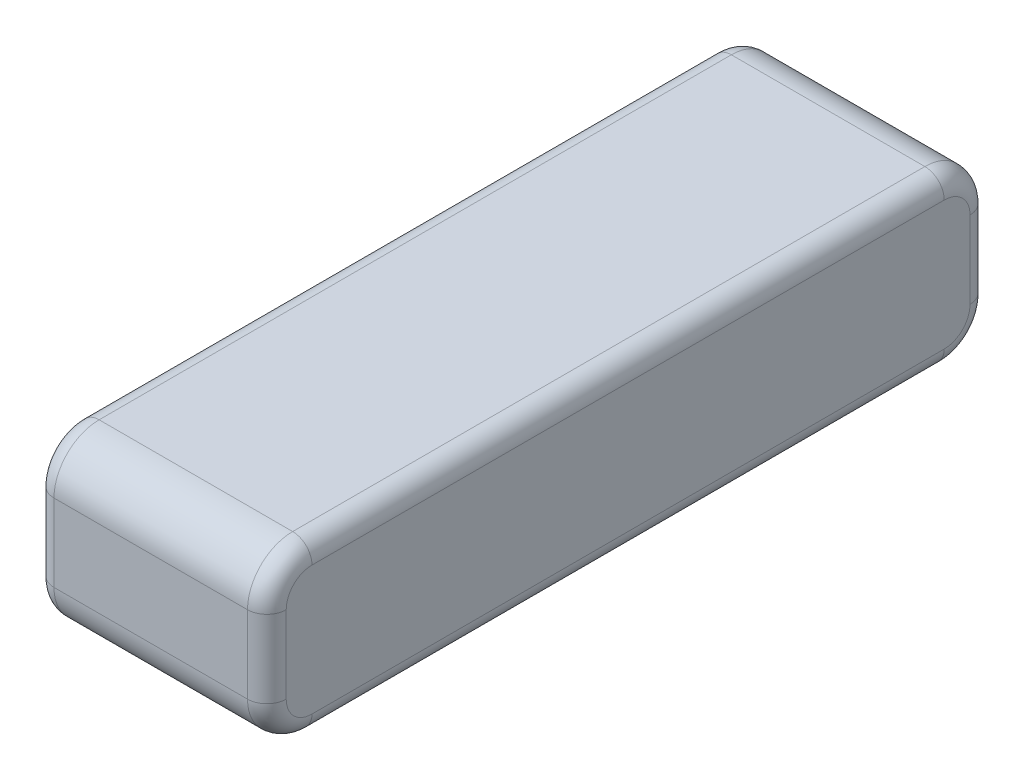
ISO-10303-21;
HEADER;
FILE_DESCRIPTION(('STEP AP214'),'2;1');
FILE_NAME('part.step','',(''),(''),'','','');
FILE_SCHEMA(('AUTOMOTIVE_DESIGN { 1 0 10303 214 1 1 1 1 }'));
ENDSEC;
DATA;
#1=APPLICATION_CONTEXT('core data for automotive mechanical design processes');
#2=APPLICATION_PROTOCOL_DEFINITION('international standard','automotive_design',2000,#1);
#3=PRODUCT_CONTEXT('',#1,'mechanical');
#4=PRODUCT('Part','Part','',(#3));
#5=PRODUCT_RELATED_PRODUCT_CATEGORY('part','',(#4));
#6=PRODUCT_DEFINITION_FORMATION('','',#4);
#7=PRODUCT_DEFINITION_CONTEXT('part definition',#1,'design');
#8=PRODUCT_DEFINITION('design','',#6,#7);
#9=PRODUCT_DEFINITION_SHAPE('','',#8);
#10=(LENGTH_UNIT() NAMED_UNIT(*) SI_UNIT(.MILLI.,.METRE.));
#11=(NAMED_UNIT(*) PLANE_ANGLE_UNIT() SI_UNIT($,.RADIAN.));
#12=(NAMED_UNIT(*) SI_UNIT($,.STERADIAN.) SOLID_ANGLE_UNIT());
#13=UNCERTAINTY_MEASURE_WITH_UNIT(LENGTH_MEASURE(1.E-05),#10,'distance_accuracy_value','');
#14=(GEOMETRIC_REPRESENTATION_CONTEXT(3) GLOBAL_UNCERTAINTY_ASSIGNED_CONTEXT((#13)) GLOBAL_UNIT_ASSIGNED_CONTEXT((#10,
#11,#12)) REPRESENTATION_CONTEXT('',''));
#15=CARTESIAN_POINT('',(0.,0.,0.));
#16=DIRECTION('',(0.,0.,1.));
#17=DIRECTION('',(1.,0.,0.));
#18=AXIS2_PLACEMENT_3D('',#15,#16,#17);
#19=CARTESIAN_POINT('',(18.,6.,-49.));
#20=DIRECTION('',(-1.,0.,0.));
#21=DIRECTION('',(0.,0.,1.));
#22=AXIS2_PLACEMENT_3D('',#19,#20,#21);
#23=CYLINDRICAL_SURFACE('',#22,7.);
#24=DIRECTION('',(-1.,0.,0.));
#25=VECTOR('',#24,1.);
#26=CARTESIAN_POINT('',(18.,6.,-56.));
#27=LINE('',#26,#25);
#28=CARTESIAN_POINT('',(15.,6.,-56.));
#29=VERTEX_POINT('',#28);
#30=CARTESIAN_POINT('',(-15.,6.,-56.));
#31=VERTEX_POINT('',#30);
#32=EDGE_CURVE('E265',#29,#31,#27,.T.);
#33=ORIENTED_EDGE('',*,*,#32,.T.);
#34=CARTESIAN_POINT('',(-15.,6.,-49.));
#35=DIRECTION('',(-1.,0.,0.));
#36=DIRECTION('',(0.,0.,1.));
#37=AXIS2_PLACEMENT_3D('',#34,#35,#36);
#38=CIRCLE('',#37,7.);
#39=CARTESIAN_POINT('',(-15.,13.,-49.));
#40=VERTEX_POINT('',#39);
#41=EDGE_CURVE('E230',#31,#40,#38,.F.);
#42=ORIENTED_EDGE('',*,*,#41,.T.);
#43=DIRECTION('',(-1.,0.,0.));
#44=VECTOR('',#43,1.);
#45=CARTESIAN_POINT('',(18.,13.,-49.));
#46=LINE('',#45,#44);
#47=CARTESIAN_POINT('',(15.,13.,-49.));
#48=VERTEX_POINT('',#47);
#49=EDGE_CURVE('E169',#48,#40,#46,.T.);
#50=ORIENTED_EDGE('',*,*,#49,.F.);
#51=CARTESIAN_POINT('',(15.,6.,-49.));
#52=DIRECTION('',(-1.,0.,0.));
#53=DIRECTION('',(0.,0.,1.));
#54=AXIS2_PLACEMENT_3D('',#51,#52,#53);
#55=CIRCLE('',#54,7.);
#56=EDGE_CURVE('E228',#48,#29,#55,.T.);
#57=ORIENTED_EDGE('',*,*,#56,.T.);
#58=EDGE_LOOP('',(#33,#42,#50,#57));
#59=FACE_BOUND('',#58,.T.);
#60=ADVANCED_FACE('F33',(#59),#23,.T.);
#61=CARTESIAN_POINT('',(18.,13.,49.));
#62=DIRECTION('',(0.,-1.,0.));
#63=DIRECTION('',(0.,0.,-1.));
#64=AXIS2_PLACEMENT_3D('',#61,#62,#63);
#65=PLANE('',#64);
#66=ORIENTED_EDGE('',*,*,#49,.T.);
#67=DIRECTION('',(0.,0.,1.));
#68=VECTOR('',#67,1.);
#69=CARTESIAN_POINT('',(-15.,13.,49.));
#70=LINE('',#69,#68);
#71=CARTESIAN_POINT('',(-15.,13.,49.));
#72=VERTEX_POINT('',#71);
#73=EDGE_CURVE('E168',#40,#72,#70,.T.);
#74=ORIENTED_EDGE('',*,*,#73,.T.);
#75=DIRECTION('',(-1.,0.,0.));
#76=VECTOR('',#75,1.);
#77=CARTESIAN_POINT('',(18.,13.,49.));
#78=LINE('',#77,#76);
#79=CARTESIAN_POINT('',(15.,13.,49.));
#80=VERTEX_POINT('',#79);
#81=EDGE_CURVE('E150',#80,#72,#78,.T.);
#82=ORIENTED_EDGE('',*,*,#81,.F.);
#83=DIRECTION('',(0.,0.,1.));
#84=VECTOR('',#83,1.);
#85=CARTESIAN_POINT('',(15.,13.,49.));
#86=LINE('',#85,#84);
#87=EDGE_CURVE('E165',#80,#48,#86,.F.);
#88=ORIENTED_EDGE('',*,*,#87,.T.);
#89=EDGE_LOOP('',(#66,#74,#82,#88));
#90=FACE_BOUND('',#89,.T.);
#91=ADVANCED_FACE('F163',(#90),#65,.F.);
#92=CARTESIAN_POINT('',(18.,6.,49.));
#93=DIRECTION('',(-1.,0.,0.));
#94=DIRECTION('',(0.,0.,1.));
#95=AXIS2_PLACEMENT_3D('',#92,#93,#94);
#96=CYLINDRICAL_SURFACE('',#95,7.);
#97=ORIENTED_EDGE('',*,*,#81,.T.);
#98=CARTESIAN_POINT('',(-15.,6.,49.));
#99=DIRECTION('',(-1.,0.,0.));
#100=DIRECTION('',(0.,0.,1.));
#101=AXIS2_PLACEMENT_3D('',#98,#99,#100);
#102=CIRCLE('',#101,7.);
#103=CARTESIAN_POINT('',(-15.,6.,56.));
#104=VERTEX_POINT('',#103);
#105=EDGE_CURVE('E157',#72,#104,#102,.F.);
#106=ORIENTED_EDGE('',*,*,#105,.T.);
#107=DIRECTION('',(-1.,0.,0.));
#108=VECTOR('',#107,1.);
#109=CARTESIAN_POINT('',(18.,6.,56.));
#110=LINE('',#109,#108);
#111=CARTESIAN_POINT('',(15.,6.,56.));
#112=VERTEX_POINT('',#111);
#113=EDGE_CURVE('E152',#112,#104,#110,.T.);
#114=ORIENTED_EDGE('',*,*,#113,.F.);
#115=CARTESIAN_POINT('',(15.,6.,49.));
#116=DIRECTION('',(-1.,0.,0.));
#117=DIRECTION('',(0.,0.,1.));
#118=AXIS2_PLACEMENT_3D('',#115,#116,#117);
#119=CIRCLE('',#118,7.);
#120=EDGE_CURVE('E147',#112,#80,#119,.T.);
#121=ORIENTED_EDGE('',*,*,#120,.T.);
#122=EDGE_LOOP('',(#97,#106,#114,#121));
#123=FACE_BOUND('',#122,.T.);
#124=ADVANCED_FACE('F149',(#123),#96,.T.);
#125=CARTESIAN_POINT('',(18.,6.,56.));
#126=DIRECTION('',(0.,0.,-1.));
#127=DIRECTION('',(-1.,0.,0.));
#128=AXIS2_PLACEMENT_3D('',#125,#126,#127);
#129=PLANE('',#128);
#130=ORIENTED_EDGE('',*,*,#113,.T.);
#131=DIRECTION('',(0.,-1.,0.));
#132=VECTOR('',#131,1.);
#133=CARTESIAN_POINT('',(-15.,-6.,56.));
#134=LINE('',#133,#132);
#135=CARTESIAN_POINT('',(-15.,-6.,56.));
#136=VERTEX_POINT('',#135);
#137=EDGE_CURVE('E209',#104,#136,#134,.T.);
#138=ORIENTED_EDGE('',*,*,#137,.T.);
#139=DIRECTION('',(-1.,0.,0.));
#140=VECTOR('',#139,1.);
#141=CARTESIAN_POINT('',(18.,-6.,56.));
#142=LINE('',#141,#140);
#143=CARTESIAN_POINT('',(15.,-6.,56.));
#144=VERTEX_POINT('',#143);
#145=EDGE_CURVE('E290',#144,#136,#142,.T.);
#146=ORIENTED_EDGE('',*,*,#145,.F.);
#147=DIRECTION('',(0.,-1.,0.));
#148=VECTOR('',#147,1.);
#149=CARTESIAN_POINT('',(15.,6.,56.));
#150=LINE('',#149,#148);
#151=EDGE_CURVE('E207',#144,#112,#150,.F.);
#152=ORIENTED_EDGE('',*,*,#151,.T.);
#153=EDGE_LOOP('',(#130,#138,#146,#152));
#154=FACE_BOUND('',#153,.T.);
#155=ADVANCED_FACE('F287',(#154),#129,.F.);
#156=CARTESIAN_POINT('',(18.,-6.,49.));
#157=DIRECTION('',(-1.,0.,0.));
#158=DIRECTION('',(0.,0.,1.));
#159=AXIS2_PLACEMENT_3D('',#156,#157,#158);
#160=CYLINDRICAL_SURFACE('',#159,7.);
#161=ORIENTED_EDGE('',*,*,#145,.T.);
#162=CARTESIAN_POINT('',(-15.,-6.,49.));
#163=DIRECTION('',(-1.,0.,0.));
#164=DIRECTION('',(0.,0.,1.));
#165=AXIS2_PLACEMENT_3D('',#162,#163,#164);
#166=CIRCLE('',#165,7.);
#167=CARTESIAN_POINT('',(-15.,-13.,49.));
#168=VERTEX_POINT('',#167);
#169=EDGE_CURVE('E213',#136,#168,#166,.F.);
#170=ORIENTED_EDGE('',*,*,#169,.T.);
#171=DIRECTION('',(-1.,0.,0.));
#172=VECTOR('',#171,1.);
#173=CARTESIAN_POINT('',(18.,-13.,49.));
#174=LINE('',#173,#172);
#175=CARTESIAN_POINT('',(15.,-13.,49.));
#176=VERTEX_POINT('',#175);
#177=EDGE_CURVE('E293',#176,#168,#174,.T.);
#178=ORIENTED_EDGE('',*,*,#177,.F.);
#179=CARTESIAN_POINT('',(15.,-6.,49.));
#180=DIRECTION('',(-1.,0.,0.));
#181=DIRECTION('',(0.,0.,1.));
#182=AXIS2_PLACEMENT_3D('',#179,#180,#181);
#183=CIRCLE('',#182,7.);
#184=EDGE_CURVE('E211',#176,#144,#183,.T.);
#185=ORIENTED_EDGE('',*,*,#184,.T.);
#186=EDGE_LOOP('',(#161,#170,#178,#185));
#187=FACE_BOUND('',#186,.T.);
#188=ADVANCED_FACE('F338',(#187),#160,.T.);
#189=CARTESIAN_POINT('',(18.,-13.,49.));
#190=DIRECTION('',(0.,1.,0.));
#191=DIRECTION('',(0.,0.,1.));
#192=AXIS2_PLACEMENT_3D('',#189,#190,#191);
#193=PLANE('',#192);
#194=ORIENTED_EDGE('',*,*,#177,.T.);
#195=DIRECTION('',(0.,0.,-1.));
#196=VECTOR('',#195,1.);
#197=CARTESIAN_POINT('',(-15.,-13.,-49.));
#198=LINE('',#197,#196);
#199=CARTESIAN_POINT('',(-15.,-13.,-49.));
#200=VERTEX_POINT('',#199);
#201=EDGE_CURVE('E217',#168,#200,#198,.T.);
#202=ORIENTED_EDGE('',*,*,#201,.T.);
#203=DIRECTION('',(-1.,0.,0.));
#204=VECTOR('',#203,1.);
#205=CARTESIAN_POINT('',(18.,-13.,-49.));
#206=LINE('',#205,#204);
#207=CARTESIAN_POINT('',(15.,-13.,-49.));
#208=VERTEX_POINT('',#207);
#209=EDGE_CURVE('E297',#208,#200,#206,.T.);
#210=ORIENTED_EDGE('',*,*,#209,.F.);
#211=DIRECTION('',(0.,0.,-1.));
#212=VECTOR('',#211,1.);
#213=CARTESIAN_POINT('',(15.,-13.,49.));
#214=LINE('',#213,#212);
#215=EDGE_CURVE('E215',#208,#176,#214,.F.);
#216=ORIENTED_EDGE('',*,*,#215,.T.);
#217=EDGE_LOOP('',(#194,#202,#210,#216));
#218=FACE_BOUND('',#217,.T.);
#219=ADVANCED_FACE('F341',(#218),#193,.F.);
#220=CARTESIAN_POINT('',(18.,-6.,-49.));
#221=DIRECTION('',(-1.,0.,0.));
#222=DIRECTION('',(0.,0.,1.));
#223=AXIS2_PLACEMENT_3D('',#220,#221,#222);
#224=CYLINDRICAL_SURFACE('',#223,7.);
#225=ORIENTED_EDGE('',*,*,#209,.T.);
#226=CARTESIAN_POINT('',(-15.,-6.,-49.));
#227=DIRECTION('',(-1.,0.,0.));
#228=DIRECTION('',(0.,0.,1.));
#229=AXIS2_PLACEMENT_3D('',#226,#227,#228);
#230=CIRCLE('',#229,7.);
#231=CARTESIAN_POINT('',(-15.,-6.,-56.));
#232=VERTEX_POINT('',#231);
#233=EDGE_CURVE('E221',#200,#232,#230,.F.);
#234=ORIENTED_EDGE('',*,*,#233,.T.);
#235=DIRECTION('',(-1.,0.,0.));
#236=VECTOR('',#235,1.);
#237=CARTESIAN_POINT('',(18.,-6.,-56.));
#238=LINE('',#237,#236);
#239=CARTESIAN_POINT('',(15.,-6.,-56.));
#240=VERTEX_POINT('',#239);
#241=EDGE_CURVE('E302',#240,#232,#238,.T.);
#242=ORIENTED_EDGE('',*,*,#241,.F.);
#243=CARTESIAN_POINT('',(15.,-6.,-49.));
#244=DIRECTION('',(-1.,0.,0.));
#245=DIRECTION('',(0.,0.,1.));
#246=AXIS2_PLACEMENT_3D('',#243,#244,#245);
#247=CIRCLE('',#246,7.);
#248=EDGE_CURVE('E219',#240,#208,#247,.T.);
#249=ORIENTED_EDGE('',*,*,#248,.T.);
#250=EDGE_LOOP('',(#225,#234,#242,#249));
#251=FACE_BOUND('',#250,.T.);
#252=ADVANCED_FACE('F355',(#251),#224,.T.);
#253=CARTESIAN_POINT('',(18.,6.,-56.));
#254=DIRECTION('',(0.,0.,1.));
#255=DIRECTION('',(1.,0.,0.));
#256=AXIS2_PLACEMENT_3D('',#253,#254,#255);
#257=PLANE('',#256);
#258=ORIENTED_EDGE('',*,*,#241,.T.);
#259=DIRECTION('',(0.,1.,0.));
#260=VECTOR('',#259,1.);
#261=CARTESIAN_POINT('',(-15.,6.,-56.));
#262=LINE('',#261,#260);
#263=EDGE_CURVE('E226',#232,#31,#262,.T.);
#264=ORIENTED_EDGE('',*,*,#263,.T.);
#265=ORIENTED_EDGE('',*,*,#32,.F.);
#266=DIRECTION('',(0.,1.,0.));
#267=VECTOR('',#266,1.);
#268=CARTESIAN_POINT('',(15.,6.,-56.));
#269=LINE('',#268,#267);
#270=EDGE_CURVE('E223',#29,#240,#269,.F.);
#271=ORIENTED_EDGE('',*,*,#270,.T.);
#272=EDGE_LOOP('',(#258,#264,#265,#271));
#273=FACE_BOUND('',#272,.T.);
#274=ADVANCED_FACE('F356',(#273),#257,.F.);
#275=CARTESIAN_POINT('',(18.,6.,-49.));
#276=DIRECTION('',(-1.,0.,0.));
#277=DIRECTION('',(0.,0.,1.));
#278=AXIS2_PLACEMENT_3D('',#275,#276,#277);
#279=PLANE('',#278);
#280=CARTESIAN_POINT('',(18.,-6.,-49.));
#281=DIRECTION('',(-1.,0.,0.));
#282=DIRECTION('',(0.,0.,1.));
#283=AXIS2_PLACEMENT_3D('',#280,#281,#282);
#284=CIRCLE('',#283,4.);
#285=CARTESIAN_POINT('',(18.,-10.,-49.));
#286=VERTEX_POINT('',#285);
#287=CARTESIAN_POINT('',(18.,-6.,-53.));
#288=VERTEX_POINT('',#287);
#289=EDGE_CURVE('E42',#286,#288,#284,.F.);
#290=ORIENTED_EDGE('',*,*,#289,.T.);
#291=DIRECTION('',(0.,1.,0.));
#292=VECTOR('',#291,1.);
#293=CARTESIAN_POINT('',(18.,6.,-53.));
#294=LINE('',#293,#292);
#295=CARTESIAN_POINT('',(18.,6.,-53.));
#296=VERTEX_POINT('',#295);
#297=EDGE_CURVE('E11',#288,#296,#294,.T.);
#298=ORIENTED_EDGE('',*,*,#297,.T.);
#299=CARTESIAN_POINT('',(18.,6.,-49.));
#300=DIRECTION('',(-1.,0.,0.));
#301=DIRECTION('',(0.,0.,1.));
#302=AXIS2_PLACEMENT_3D('',#299,#300,#301);
#303=CIRCLE('',#302,4.);
#304=CARTESIAN_POINT('',(18.,10.,-49.));
#305=VERTEX_POINT('',#304);
#306=EDGE_CURVE('E232',#296,#305,#303,.F.);
#307=ORIENTED_EDGE('',*,*,#306,.T.);
#308=DIRECTION('',(0.,0.,1.));
#309=VECTOR('',#308,1.);
#310=CARTESIAN_POINT('',(18.,10.,-49.));
#311=LINE('',#310,#309);
#312=CARTESIAN_POINT('',(18.,10.,49.));
#313=VERTEX_POINT('',#312);
#314=EDGE_CURVE('E234',#305,#313,#311,.T.);
#315=ORIENTED_EDGE('',*,*,#314,.T.);
#316=CARTESIAN_POINT('',(18.,6.,49.));
#317=DIRECTION('',(-1.,0.,0.));
#318=DIRECTION('',(0.,0.,1.));
#319=AXIS2_PLACEMENT_3D('',#316,#317,#318);
#320=CIRCLE('',#319,4.);
#321=CARTESIAN_POINT('',(18.,6.,53.));
#322=VERTEX_POINT('',#321);
#323=EDGE_CURVE('E175',#313,#322,#320,.F.);
#324=ORIENTED_EDGE('',*,*,#323,.T.);
#325=DIRECTION('',(0.,-1.,0.));
#326=VECTOR('',#325,1.);
#327=CARTESIAN_POINT('',(18.,6.,53.));
#328=LINE('',#327,#326);
#329=CARTESIAN_POINT('',(18.,-6.,53.));
#330=VERTEX_POINT('',#329);
#331=EDGE_CURVE('E237',#322,#330,#328,.T.);
#332=ORIENTED_EDGE('',*,*,#331,.T.);
#333=CARTESIAN_POINT('',(18.,-6.,49.));
#334=DIRECTION('',(-1.,0.,0.));
#335=DIRECTION('',(0.,0.,1.));
#336=AXIS2_PLACEMENT_3D('',#333,#334,#335);
#337=CIRCLE('',#336,4.);
#338=CARTESIAN_POINT('',(18.,-10.,49.));
#339=VERTEX_POINT('',#338);
#340=EDGE_CURVE('E239',#330,#339,#337,.F.);
#341=ORIENTED_EDGE('',*,*,#340,.T.);
#342=DIRECTION('',(0.,0.,-1.));
#343=VECTOR('',#342,1.);
#344=CARTESIAN_POINT('',(18.,-10.,-49.));
#345=LINE('',#344,#343);
#346=EDGE_CURVE('E53',#339,#286,#345,.T.);
#347=ORIENTED_EDGE('',*,*,#346,.T.);
#348=EDGE_LOOP('',(#290,#298,#307,#315,#324,#332,#341,#347));
#349=FACE_BOUND('',#348,.T.);
#350=ADVANCED_FACE('F365',(#349),#279,.F.);
#351=CARTESIAN_POINT('',(-18.,6.,-49.));
#352=DIRECTION('',(-1.,0.,0.));
#353=DIRECTION('',(0.,0.,1.));
#354=AXIS2_PLACEMENT_3D('',#351,#352,#353);
#355=PLANE('',#354);
#356=CARTESIAN_POINT('',(-18.,6.,49.));
#357=DIRECTION('',(-1.,0.,0.));
#358=DIRECTION('',(0.,0.,1.));
#359=AXIS2_PLACEMENT_3D('',#356,#357,#358);
#360=CIRCLE('',#359,4.);
#361=CARTESIAN_POINT('',(-18.,6.,53.));
#362=VERTEX_POINT('',#361);
#363=CARTESIAN_POINT('',(-18.,10.,49.));
#364=VERTEX_POINT('',#363);
#365=EDGE_CURVE('E202',#362,#364,#360,.T.);
#366=ORIENTED_EDGE('',*,*,#365,.T.);
#367=DIRECTION('',(0.,0.,1.));
#368=VECTOR('',#367,1.);
#369=CARTESIAN_POINT('',(-18.,10.,-49.));
#370=LINE('',#369,#368);
#371=CARTESIAN_POINT('',(-18.,10.,-49.));
#372=VERTEX_POINT('',#371);
#373=EDGE_CURVE('E158',#364,#372,#370,.F.);
#374=ORIENTED_EDGE('',*,*,#373,.T.);
#375=CARTESIAN_POINT('',(-18.,6.,-49.));
#376=DIRECTION('',(-1.,0.,0.));
#377=DIRECTION('',(0.,0.,1.));
#378=AXIS2_PLACEMENT_3D('',#375,#376,#377);
#379=CIRCLE('',#378,4.);
#380=CARTESIAN_POINT('',(-18.,6.,-53.));
#381=VERTEX_POINT('',#380);
#382=EDGE_CURVE('E187',#372,#381,#379,.T.);
#383=ORIENTED_EDGE('',*,*,#382,.T.);
#384=DIRECTION('',(0.,1.,0.));
#385=VECTOR('',#384,1.);
#386=CARTESIAN_POINT('',(-18.,-6.,-53.));
#387=LINE('',#386,#385);
#388=CARTESIAN_POINT('',(-18.,-6.,-53.));
#389=VERTEX_POINT('',#388);
#390=EDGE_CURVE('E192',#381,#389,#387,.F.);
#391=ORIENTED_EDGE('',*,*,#390,.T.);
#392=CARTESIAN_POINT('',(-18.,-6.,-49.));
#393=DIRECTION('',(-1.,0.,0.));
#394=DIRECTION('',(0.,0.,1.));
#395=AXIS2_PLACEMENT_3D('',#392,#393,#394);
#396=CIRCLE('',#395,4.);
#397=CARTESIAN_POINT('',(-18.,-10.,-49.));
#398=VERTEX_POINT('',#397);
#399=EDGE_CURVE('E194',#389,#398,#396,.T.);
#400=ORIENTED_EDGE('',*,*,#399,.T.);
#401=DIRECTION('',(0.,0.,-1.));
#402=VECTOR('',#401,1.);
#403=CARTESIAN_POINT('',(-18.,-10.,49.));
#404=LINE('',#403,#402);
#405=CARTESIAN_POINT('',(-18.,-10.,49.));
#406=VERTEX_POINT('',#405);
#407=EDGE_CURVE('E196',#398,#406,#404,.F.);
#408=ORIENTED_EDGE('',*,*,#407,.T.);
#409=CARTESIAN_POINT('',(-18.,-6.,49.));
#410=DIRECTION('',(-1.,0.,0.));
#411=DIRECTION('',(0.,0.,1.));
#412=AXIS2_PLACEMENT_3D('',#409,#410,#411);
#413=CIRCLE('',#412,4.);
#414=CARTESIAN_POINT('',(-18.,-6.,53.));
#415=VERTEX_POINT('',#414);
#416=EDGE_CURVE('E198',#406,#415,#413,.T.);
#417=ORIENTED_EDGE('',*,*,#416,.T.);
#418=DIRECTION('',(0.,-1.,0.));
#419=VECTOR('',#418,1.);
#420=CARTESIAN_POINT('',(-18.,6.,53.));
#421=LINE('',#420,#419);
#422=EDGE_CURVE('E200',#415,#362,#421,.F.);
#423=ORIENTED_EDGE('',*,*,#422,.T.);
#424=EDGE_LOOP('',(#366,#374,#383,#391,#400,#408,#417,#423));
#425=FACE_BOUND('',#424,.T.);
#426=ADVANCED_FACE('F367',(#425),#355,.T.);
#427=CARTESIAN_POINT('',(-15.,-10.,49.));
#428=DIRECTION('',(0.,0.,1.));
#429=DIRECTION('',(1.,0.,0.));
#430=AXIS2_PLACEMENT_3D('',#427,#428,#429);
#431=CYLINDRICAL_SURFACE('',#430,3.);
#432=CARTESIAN_POINT('',(-15.,-10.,49.));
#433=DIRECTION('',(0.,0.,1.));
#434=DIRECTION('',(1.,0.,0.));
#435=AXIS2_PLACEMENT_3D('',#432,#433,#434);
#436=CIRCLE('',#435,3.);
#437=EDGE_CURVE('E259',#406,#168,#436,.T.);
#438=ORIENTED_EDGE('',*,*,#437,.F.);
#439=ORIENTED_EDGE('',*,*,#407,.F.);
#440=CARTESIAN_POINT('',(-15.,-10.,-49.));
#441=DIRECTION('',(0.,0.,-1.));
#442=DIRECTION('',(-1.,0.,0.));
#443=AXIS2_PLACEMENT_3D('',#440,#441,#442);
#444=CIRCLE('',#443,3.);
#445=EDGE_CURVE('E262',#200,#398,#444,.T.);
#446=ORIENTED_EDGE('',*,*,#445,.F.);
#447=ORIENTED_EDGE('',*,*,#201,.F.);
#448=EDGE_LOOP('',(#438,#439,#446,#447));
#449=FACE_BOUND('',#448,.T.);
#450=ADVANCED_FACE('F346',(#449),#431,.T.);
#451=CARTESIAN_POINT('',(-15.,-6.,-49.));
#452=DIRECTION('',(-1.,0.,0.));
#453=DIRECTION('',(0.,0.,1.));
#454=AXIS2_PLACEMENT_3D('',#451,#452,#453);
#455=TOROIDAL_SURFACE('',#454,4.,3.);
#456=ORIENTED_EDGE('',*,*,#445,.T.);
#457=ORIENTED_EDGE('',*,*,#399,.F.);
#458=CARTESIAN_POINT('',(-15.,-6.,-53.));
#459=DIRECTION('',(0.,1.,0.));
#460=DIRECTION('',(0.,0.,1.));
#461=AXIS2_PLACEMENT_3D('',#458,#459,#460);
#462=CIRCLE('',#461,3.);
#463=EDGE_CURVE('E256',#232,#389,#462,.T.);
#464=ORIENTED_EDGE('',*,*,#463,.F.);
#465=ORIENTED_EDGE('',*,*,#233,.F.);
#466=EDGE_LOOP('',(#456,#457,#464,#465));
#467=FACE_BOUND('',#466,.T.);
#468=ADVANCED_FACE('F352',(#467),#455,.T.);
#469=CARTESIAN_POINT('',(-15.,-6.,49.));
#470=DIRECTION('',(-1.,0.,0.));
#471=DIRECTION('',(0.,0.,1.));
#472=AXIS2_PLACEMENT_3D('',#469,#470,#471);
#473=TOROIDAL_SURFACE('',#472,4.,3.);
#474=ORIENTED_EDGE('',*,*,#437,.T.);
#475=ORIENTED_EDGE('',*,*,#169,.F.);
#476=CARTESIAN_POINT('',(-15.,-6.,53.));
#477=DIRECTION('',(0.,1.,0.));
#478=DIRECTION('',(0.,0.,1.));
#479=AXIS2_PLACEMENT_3D('',#476,#477,#478);
#480=CIRCLE('',#479,3.);
#481=EDGE_CURVE('E253',#415,#136,#480,.T.);
#482=ORIENTED_EDGE('',*,*,#481,.F.);
#483=ORIENTED_EDGE('',*,*,#416,.F.);
#484=EDGE_LOOP('',(#474,#475,#482,#483));
#485=FACE_BOUND('',#484,.T.);
#486=ADVANCED_FACE('F335',(#485),#473,.T.);
#487=CARTESIAN_POINT('',(-15.,6.,-53.));
#488=DIRECTION('',(0.,-1.,0.));
#489=DIRECTION('',(0.,0.,-1.));
#490=AXIS2_PLACEMENT_3D('',#487,#488,#489);
#491=CYLINDRICAL_SURFACE('',#490,3.);
#492=ORIENTED_EDGE('',*,*,#463,.T.);
#493=ORIENTED_EDGE('',*,*,#390,.F.);
#494=CARTESIAN_POINT('',(-15.,6.,-53.));
#495=DIRECTION('',(0.,1.,0.));
#496=DIRECTION('',(0.,0.,1.));
#497=AXIS2_PLACEMENT_3D('',#494,#495,#496);
#498=CIRCLE('',#497,3.);
#499=EDGE_CURVE('E250',#31,#381,#498,.T.);
#500=ORIENTED_EDGE('',*,*,#499,.F.);
#501=ORIENTED_EDGE('',*,*,#263,.F.);
#502=EDGE_LOOP('',(#492,#493,#500,#501));
#503=FACE_BOUND('',#502,.T.);
#504=ADVANCED_FACE('F315',(#503),#491,.T.);
#505=CARTESIAN_POINT('',(-15.,6.,53.));
#506=DIRECTION('',(0.,1.,0.));
#507=DIRECTION('',(0.,0.,1.));
#508=AXIS2_PLACEMENT_3D('',#505,#506,#507);
#509=CYLINDRICAL_SURFACE('',#508,3.);
#510=ORIENTED_EDGE('',*,*,#481,.T.);
#511=ORIENTED_EDGE('',*,*,#137,.F.);
#512=CARTESIAN_POINT('',(-15.,6.,53.));
#513=DIRECTION('',(0.,1.,0.));
#514=DIRECTION('',(0.,0.,1.));
#515=AXIS2_PLACEMENT_3D('',#512,#513,#514);
#516=CIRCLE('',#515,3.);
#517=EDGE_CURVE('E247',#362,#104,#516,.T.);
#518=ORIENTED_EDGE('',*,*,#517,.F.);
#519=ORIENTED_EDGE('',*,*,#422,.F.);
#520=EDGE_LOOP('',(#510,#511,#518,#519));
#521=FACE_BOUND('',#520,.T.);
#522=ADVANCED_FACE('F331',(#521),#509,.T.);
#523=CARTESIAN_POINT('',(-15.,6.,-49.));
#524=DIRECTION('',(-1.,0.,0.));
#525=DIRECTION('',(0.,0.,1.));
#526=AXIS2_PLACEMENT_3D('',#523,#524,#525);
#527=TOROIDAL_SURFACE('',#526,4.,3.);
#528=ORIENTED_EDGE('',*,*,#499,.T.);
#529=ORIENTED_EDGE('',*,*,#382,.F.);
#530=CARTESIAN_POINT('',(-15.,10.,-49.));
#531=DIRECTION('',(0.,0.,1.));
#532=DIRECTION('',(1.,0.,0.));
#533=AXIS2_PLACEMENT_3D('',#530,#531,#532);
#534=CIRCLE('',#533,3.);
#535=EDGE_CURVE('E245',#40,#372,#534,.T.);
#536=ORIENTED_EDGE('',*,*,#535,.F.);
#537=ORIENTED_EDGE('',*,*,#41,.F.);
#538=EDGE_LOOP('',(#528,#529,#536,#537));
#539=FACE_BOUND('',#538,.T.);
#540=ADVANCED_FACE('F319',(#539),#527,.T.);
#541=CARTESIAN_POINT('',(-15.,6.,49.));
#542=DIRECTION('',(-1.,0.,0.));
#543=DIRECTION('',(0.,0.,1.));
#544=AXIS2_PLACEMENT_3D('',#541,#542,#543);
#545=TOROIDAL_SURFACE('',#544,4.,3.);
#546=ORIENTED_EDGE('',*,*,#517,.T.);
#547=ORIENTED_EDGE('',*,*,#105,.F.);
#548=CARTESIAN_POINT('',(-15.,10.,49.));
#549=DIRECTION('',(0.,0.,-1.));
#550=DIRECTION('',(-1.,0.,0.));
#551=AXIS2_PLACEMENT_3D('',#548,#549,#550);
#552=CIRCLE('',#551,3.);
#553=EDGE_CURVE('E243',#364,#72,#552,.T.);
#554=ORIENTED_EDGE('',*,*,#553,.F.);
#555=ORIENTED_EDGE('',*,*,#365,.F.);
#556=EDGE_LOOP('',(#546,#547,#554,#555));
#557=FACE_BOUND('',#556,.T.);
#558=ADVANCED_FACE('F327',(#557),#545,.T.);
#559=CARTESIAN_POINT('',(-15.,10.,49.));
#560=DIRECTION('',(0.,0.,-1.));
#561=DIRECTION('',(0.,1.,0.));
#562=AXIS2_PLACEMENT_3D('',#559,#560,#561);
#563=CYLINDRICAL_SURFACE('',#562,3.);
#564=ORIENTED_EDGE('',*,*,#535,.T.);
#565=ORIENTED_EDGE('',*,*,#373,.F.);
#566=ORIENTED_EDGE('',*,*,#553,.T.);
#567=ORIENTED_EDGE('',*,*,#73,.F.);
#568=EDGE_LOOP('',(#564,#565,#566,#567));
#569=FACE_BOUND('',#568,.T.);
#570=ADVANCED_FACE('F322',(#569),#563,.T.);
#571=CARTESIAN_POINT('',(15.,6.,53.));
#572=DIRECTION('',(0.,-1.,0.));
#573=DIRECTION('',(0.,0.,-1.));
#574=AXIS2_PLACEMENT_3D('',#571,#572,#573);
#575=CYLINDRICAL_SURFACE('',#574,3.);
#576=CARTESIAN_POINT('',(15.,6.,53.));
#577=DIRECTION('',(0.,1.,0.));
#578=DIRECTION('',(0.,0.,1.));
#579=AXIS2_PLACEMENT_3D('',#576,#577,#578);
#580=CIRCLE('',#579,3.);
#581=EDGE_CURVE('E274',#112,#322,#580,.T.);
#582=ORIENTED_EDGE('',*,*,#581,.F.);
#583=ORIENTED_EDGE('',*,*,#151,.F.);
#584=CARTESIAN_POINT('',(15.,-6.,53.));
#585=DIRECTION('',(0.,-1.,0.));
#586=DIRECTION('',(0.,0.,-1.));
#587=AXIS2_PLACEMENT_3D('',#584,#585,#586);
#588=CIRCLE('',#587,3.);
#589=EDGE_CURVE('E37',#330,#144,#588,.T.);
#590=ORIENTED_EDGE('',*,*,#589,.F.);
#591=ORIENTED_EDGE('',*,*,#331,.F.);
#592=EDGE_LOOP('',(#582,#583,#590,#591));
#593=FACE_BOUND('',#592,.T.);
#594=ADVANCED_FACE('F35',(#593),#575,.T.);
#595=CARTESIAN_POINT('',(15.,-6.,49.));
#596=DIRECTION('',(-1.,0.,0.));
#597=DIRECTION('',(0.,0.,1.));
#598=AXIS2_PLACEMENT_3D('',#595,#596,#597);
#599=TOROIDAL_SURFACE('',#598,4.,3.);
#600=ORIENTED_EDGE('',*,*,#589,.T.);
#601=ORIENTED_EDGE('',*,*,#184,.F.);
#602=CARTESIAN_POINT('',(15.,-10.,49.));
#603=DIRECTION('',(0.,0.,-1.));
#604=DIRECTION('',(-1.,0.,0.));
#605=AXIS2_PLACEMENT_3D('',#602,#603,#604);
#606=CIRCLE('',#605,3.);
#607=EDGE_CURVE('E178',#339,#176,#606,.T.);
#608=ORIENTED_EDGE('',*,*,#607,.F.);
#609=ORIENTED_EDGE('',*,*,#340,.F.);
#610=EDGE_LOOP('',(#600,#601,#608,#609));
#611=FACE_BOUND('',#610,.T.);
#612=ADVANCED_FACE('F280',(#611),#599,.T.);
#613=CARTESIAN_POINT('',(15.,6.,49.));
#614=DIRECTION('',(-1.,0.,0.));
#615=DIRECTION('',(0.,0.,1.));
#616=AXIS2_PLACEMENT_3D('',#613,#614,#615);
#617=TOROIDAL_SURFACE('',#616,4.,3.);
#618=ORIENTED_EDGE('',*,*,#581,.T.);
#619=ORIENTED_EDGE('',*,*,#323,.F.);
#620=CARTESIAN_POINT('',(15.,10.,49.));
#621=DIRECTION('',(0.,0.,-1.));
#622=DIRECTION('',(-1.,0.,0.));
#623=AXIS2_PLACEMENT_3D('',#620,#621,#622);
#624=CIRCLE('',#623,3.);
#625=EDGE_CURVE('E173',#80,#313,#624,.T.);
#626=ORIENTED_EDGE('',*,*,#625,.F.);
#627=ORIENTED_EDGE('',*,*,#120,.F.);
#628=EDGE_LOOP('',(#618,#619,#626,#627));
#629=FACE_BOUND('',#628,.T.);
#630=ADVANCED_FACE('F174',(#629),#617,.T.);
#631=CARTESIAN_POINT('',(15.,-10.,-49.));
#632=DIRECTION('',(0.,0.,-1.));
#633=DIRECTION('',(-1.,0.,0.));
#634=AXIS2_PLACEMENT_3D('',#631,#632,#633);
#635=CYLINDRICAL_SURFACE('',#634,3.);
#636=ORIENTED_EDGE('',*,*,#607,.T.);
#637=ORIENTED_EDGE('',*,*,#215,.F.);
#638=CARTESIAN_POINT('',(15.,-10.,-49.));
#639=DIRECTION('',(0.,0.,-1.));
#640=DIRECTION('',(-1.,0.,0.));
#641=AXIS2_PLACEMENT_3D('',#638,#639,#640);
#642=CIRCLE('',#641,3.);
#643=EDGE_CURVE('E179',#286,#208,#642,.T.);
#644=ORIENTED_EDGE('',*,*,#643,.F.);
#645=ORIENTED_EDGE('',*,*,#346,.F.);
#646=EDGE_LOOP('',(#636,#637,#644,#645));
#647=FACE_BOUND('',#646,.T.);
#648=ADVANCED_FACE('F410',(#647),#635,.T.);
#649=CARTESIAN_POINT('',(15.,10.,-49.));
#650=DIRECTION('',(0.,0.,1.));
#651=DIRECTION('',(0.,-1.,0.));
#652=AXIS2_PLACEMENT_3D('',#649,#650,#651);
#653=CYLINDRICAL_SURFACE('',#652,3.);
#654=ORIENTED_EDGE('',*,*,#625,.T.);
#655=ORIENTED_EDGE('',*,*,#314,.F.);
#656=CARTESIAN_POINT('',(15.,10.,-49.));
#657=DIRECTION('',(0.,0.,-1.));
#658=DIRECTION('',(-1.,0.,0.));
#659=AXIS2_PLACEMENT_3D('',#656,#657,#658);
#660=CIRCLE('',#659,3.);
#661=EDGE_CURVE('E184',#48,#305,#660,.T.);
#662=ORIENTED_EDGE('',*,*,#661,.F.);
#663=ORIENTED_EDGE('',*,*,#87,.F.);
#664=EDGE_LOOP('',(#654,#655,#662,#663));
#665=FACE_BOUND('',#664,.T.);
#666=ADVANCED_FACE('F182',(#665),#653,.T.);
#667=CARTESIAN_POINT('',(15.,-6.,-49.));
#668=DIRECTION('',(-1.,0.,0.));
#669=DIRECTION('',(0.,0.,1.));
#670=AXIS2_PLACEMENT_3D('',#667,#668,#669);
#671=TOROIDAL_SURFACE('',#670,4.,3.);
#672=ORIENTED_EDGE('',*,*,#643,.T.);
#673=ORIENTED_EDGE('',*,*,#248,.F.);
#674=CARTESIAN_POINT('',(15.,-6.,-53.));
#675=DIRECTION('',(0.,1.,0.));
#676=DIRECTION('',(0.,0.,1.));
#677=AXIS2_PLACEMENT_3D('',#674,#675,#676);
#678=CIRCLE('',#677,3.);
#679=EDGE_CURVE('E268',#288,#240,#678,.T.);
#680=ORIENTED_EDGE('',*,*,#679,.F.);
#681=ORIENTED_EDGE('',*,*,#289,.F.);
#682=EDGE_LOOP('',(#672,#673,#680,#681));
#683=FACE_BOUND('',#682,.T.);
#684=ADVANCED_FACE('F404',(#683),#671,.T.);
#685=CARTESIAN_POINT('',(15.,6.,-49.));
#686=DIRECTION('',(-1.,0.,0.));
#687=DIRECTION('',(0.,0.,1.));
#688=AXIS2_PLACEMENT_3D('',#685,#686,#687);
#689=TOROIDAL_SURFACE('',#688,4.,3.);
#690=ORIENTED_EDGE('',*,*,#661,.T.);
#691=ORIENTED_EDGE('',*,*,#306,.F.);
#692=CARTESIAN_POINT('',(15.,6.,-53.));
#693=DIRECTION('',(0.,-1.,0.));
#694=DIRECTION('',(0.,0.,-1.));
#695=AXIS2_PLACEMENT_3D('',#692,#693,#694);
#696=CIRCLE('',#695,3.);
#697=EDGE_CURVE('E266',#29,#296,#696,.T.);
#698=ORIENTED_EDGE('',*,*,#697,.F.);
#699=ORIENTED_EDGE('',*,*,#56,.F.);
#700=EDGE_LOOP('',(#690,#691,#698,#699));
#701=FACE_BOUND('',#700,.T.);
#702=ADVANCED_FACE('F364',(#701),#689,.T.);
#703=CARTESIAN_POINT('',(15.,6.,-53.));
#704=DIRECTION('',(0.,1.,0.));
#705=DIRECTION('',(0.,0.,1.));
#706=AXIS2_PLACEMENT_3D('',#703,#704,#705);
#707=CYLINDRICAL_SURFACE('',#706,3.);
#708=ORIENTED_EDGE('',*,*,#679,.T.);
#709=ORIENTED_EDGE('',*,*,#270,.F.);
#710=ORIENTED_EDGE('',*,*,#697,.T.);
#711=ORIENTED_EDGE('',*,*,#297,.F.);
#712=EDGE_LOOP('',(#708,#709,#710,#711));
#713=FACE_BOUND('',#712,.T.);
#714=ADVANCED_FACE('F359',(#713),#707,.T.);
#715=CLOSED_SHELL('',(#60,#91,#124,#155,#188,#219,#252,#274,#350,#426,#450,#468,#486,#504,#522,
#540,#558,#570,#594,#612,#630,#648,#666,#684,#702,#714));
#716=MANIFOLD_SOLID_BREP('B2',#715);
#717=ADVANCED_BREP_SHAPE_REPRESENTATION('',(#18,#716),#14);
#718=SHAPE_DEFINITION_REPRESENTATION(#9,#717);
ENDSEC;
END-ISO-10303-21;
